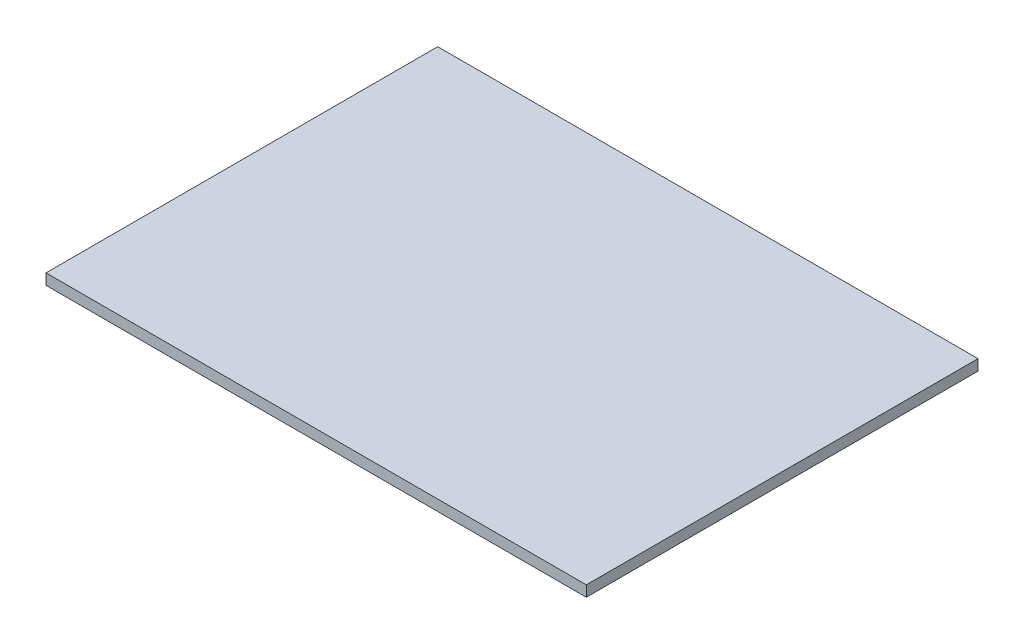
ISO-10303-21;
HEADER;
FILE_DESCRIPTION(('STEP AP214'),'2;1');
FILE_NAME('part.step','',(''),(''),'','','');
FILE_SCHEMA(('AUTOMOTIVE_DESIGN { 1 0 10303 214 1 1 1 1 }'));
ENDSEC;
DATA;
#1=APPLICATION_CONTEXT('core data for automotive mechanical design processes');
#2=APPLICATION_PROTOCOL_DEFINITION('international standard','automotive_design',2000,#1);
#3=PRODUCT_CONTEXT('',#1,'mechanical');
#4=PRODUCT('Part','Part','',(#3));
#5=PRODUCT_RELATED_PRODUCT_CATEGORY('part','',(#4));
#6=PRODUCT_DEFINITION_FORMATION('','',#4);
#7=PRODUCT_DEFINITION_CONTEXT('part definition',#1,'design');
#8=PRODUCT_DEFINITION('design','',#6,#7);
#9=PRODUCT_DEFINITION_SHAPE('','',#8);
#10=(LENGTH_UNIT() NAMED_UNIT(*) SI_UNIT(.MILLI.,.METRE.));
#11=(NAMED_UNIT(*) PLANE_ANGLE_UNIT() SI_UNIT($,.RADIAN.));
#12=(NAMED_UNIT(*) SI_UNIT($,.STERADIAN.) SOLID_ANGLE_UNIT());
#13=UNCERTAINTY_MEASURE_WITH_UNIT(LENGTH_MEASURE(1.E-05),#10,'distance_accuracy_value','');
#14=(GEOMETRIC_REPRESENTATION_CONTEXT(3) GLOBAL_UNCERTAINTY_ASSIGNED_CONTEXT((#13)) GLOBAL_UNIT_ASSIGNED_CONTEXT((#10,
#11,#12)) REPRESENTATION_CONTEXT('',''));
#15=CARTESIAN_POINT('',(0.,0.,0.));
#16=DIRECTION('',(0.,0.,1.));
#17=DIRECTION('',(1.,0.,0.));
#18=AXIS2_PLACEMENT_3D('',#15,#16,#17);
#19=CARTESIAN_POINT('',(317.5,12.7,230.1875));
#20=DIRECTION('',(-1.,0.,0.));
#21=DIRECTION('',(0.,0.,1.));
#22=AXIS2_PLACEMENT_3D('',#19,#20,#21);
#23=PLANE('',#22);
#24=DIRECTION('',(0.,0.,-1.));
#25=VECTOR('',#24,1.);
#26=CARTESIAN_POINT('',(317.5,0.,230.1875));
#27=LINE('',#26,#25);
#28=CARTESIAN_POINT('',(317.5,0.,230.1875));
#29=VERTEX_POINT('',#28);
#30=CARTESIAN_POINT('',(317.5,0.,-230.1875));
#31=VERTEX_POINT('',#30);
#32=EDGE_CURVE('E96',#29,#31,#27,.T.);
#33=ORIENTED_EDGE('',*,*,#32,.T.);
#34=DIRECTION('',(0.,-1.,0.));
#35=VECTOR('',#34,1.);
#36=CARTESIAN_POINT('',(317.5,12.7,-230.1875));
#37=LINE('',#36,#35);
#38=CARTESIAN_POINT('',(317.5,12.7,-230.1875));
#39=VERTEX_POINT('',#38);
#40=EDGE_CURVE('E11',#39,#31,#37,.T.);
#41=ORIENTED_EDGE('',*,*,#40,.F.);
#42=DIRECTION('',(0.,0.,-1.));
#43=VECTOR('',#42,1.);
#44=CARTESIAN_POINT('',(317.5,12.7,230.1875));
#45=LINE('',#44,#43);
#46=CARTESIAN_POINT('',(317.5,12.7,230.1875));
#47=VERTEX_POINT('',#46);
#48=EDGE_CURVE('E84',#47,#39,#45,.T.);
#49=ORIENTED_EDGE('',*,*,#48,.F.);
#50=DIRECTION('',(0.,-1.,0.));
#51=VECTOR('',#50,1.);
#52=CARTESIAN_POINT('',(317.5,12.7,230.1875));
#53=LINE('',#52,#51);
#54=EDGE_CURVE('E92',#47,#29,#53,.T.);
#55=ORIENTED_EDGE('',*,*,#54,.T.);
#56=EDGE_LOOP('',(#33,#41,#49,#55));
#57=FACE_BOUND('',#56,.T.);
#58=ADVANCED_FACE('F33',(#57),#23,.F.);
#59=CARTESIAN_POINT('',(-317.5,12.7,-230.1875));
#60=DIRECTION('',(0.,0.,1.));
#61=DIRECTION('',(1.,0.,0.));
#62=AXIS2_PLACEMENT_3D('',#59,#60,#61);
#63=PLANE('',#62);
#64=DIRECTION('',(-1.,0.,0.));
#65=VECTOR('',#64,1.);
#66=CARTESIAN_POINT('',(-317.5,0.,-230.1875));
#67=LINE('',#66,#65);
#68=CARTESIAN_POINT('',(-317.5,0.,-230.1875));
#69=VERTEX_POINT('',#68);
#70=EDGE_CURVE('E88',#31,#69,#67,.T.);
#71=ORIENTED_EDGE('',*,*,#70,.T.);
#72=DIRECTION('',(0.,-1.,0.));
#73=VECTOR('',#72,1.);
#74=CARTESIAN_POINT('',(-317.5,12.7,-230.1875));
#75=LINE('',#74,#73);
#76=CARTESIAN_POINT('',(-317.5,12.7,-230.1875));
#77=VERTEX_POINT('',#76);
#78=EDGE_CURVE('E41',#77,#69,#75,.T.);
#79=ORIENTED_EDGE('',*,*,#78,.F.);
#80=DIRECTION('',(-1.,0.,0.));
#81=VECTOR('',#80,1.);
#82=CARTESIAN_POINT('',(-317.5,12.7,-230.1875));
#83=LINE('',#82,#81);
#84=EDGE_CURVE('E79',#39,#77,#83,.T.);
#85=ORIENTED_EDGE('',*,*,#84,.F.);
#86=ORIENTED_EDGE('',*,*,#40,.T.);
#87=EDGE_LOOP('',(#71,#79,#85,#86));
#88=FACE_BOUND('',#87,.T.);
#89=ADVANCED_FACE('F87',(#88),#63,.F.);
#90=CARTESIAN_POINT('',(-317.5,12.7,230.1875));
#91=DIRECTION('',(1.,0.,0.));
#92=DIRECTION('',(0.,0.,-1.));
#93=AXIS2_PLACEMENT_3D('',#90,#91,#92);
#94=PLANE('',#93);
#95=DIRECTION('',(0.,0.,1.));
#96=VECTOR('',#95,1.);
#97=CARTESIAN_POINT('',(-317.5,0.,230.1875));
#98=LINE('',#97,#96);
#99=CARTESIAN_POINT('',(-317.5,0.,230.1875));
#100=VERTEX_POINT('',#99);
#101=EDGE_CURVE('E66',#69,#100,#98,.T.);
#102=ORIENTED_EDGE('',*,*,#101,.T.);
#103=DIRECTION('',(0.,-1.,0.));
#104=VECTOR('',#103,1.);
#105=CARTESIAN_POINT('',(-317.5,12.7,230.1875));
#106=LINE('',#105,#104);
#107=CARTESIAN_POINT('',(-317.5,12.7,230.1875));
#108=VERTEX_POINT('',#107);
#109=EDGE_CURVE('E89',#108,#100,#106,.T.);
#110=ORIENTED_EDGE('',*,*,#109,.F.);
#111=DIRECTION('',(0.,0.,1.));
#112=VECTOR('',#111,1.);
#113=CARTESIAN_POINT('',(-317.5,12.7,230.1875));
#114=LINE('',#113,#112);
#115=EDGE_CURVE('E82',#77,#108,#114,.T.);
#116=ORIENTED_EDGE('',*,*,#115,.F.);
#117=ORIENTED_EDGE('',*,*,#78,.T.);
#118=EDGE_LOOP('',(#102,#110,#116,#117));
#119=FACE_BOUND('',#118,.T.);
#120=ADVANCED_FACE('F90',(#119),#94,.F.);
#121=CARTESIAN_POINT('',(-317.5,12.7,230.1875));
#122=DIRECTION('',(0.,0.,-1.));
#123=DIRECTION('',(-1.,0.,0.));
#124=AXIS2_PLACEMENT_3D('',#121,#122,#123);
#125=PLANE('',#124);
#126=DIRECTION('',(1.,0.,0.));
#127=VECTOR('',#126,1.);
#128=CARTESIAN_POINT('',(-317.5,0.,230.1875));
#129=LINE('',#128,#127);
#130=EDGE_CURVE('E72',#100,#29,#129,.T.);
#131=ORIENTED_EDGE('',*,*,#130,.T.);
#132=ORIENTED_EDGE('',*,*,#54,.F.);
#133=DIRECTION('',(1.,0.,0.));
#134=VECTOR('',#133,1.);
#135=CARTESIAN_POINT('',(-317.5,12.7,230.1875));
#136=LINE('',#135,#134);
#137=EDGE_CURVE('E49',#108,#47,#136,.T.);
#138=ORIENTED_EDGE('',*,*,#137,.F.);
#139=ORIENTED_EDGE('',*,*,#109,.T.);
#140=EDGE_LOOP('',(#131,#132,#138,#139));
#141=FACE_BOUND('',#140,.T.);
#142=ADVANCED_FACE('F103',(#141),#125,.F.);
#143=CARTESIAN_POINT('',(0.,12.7,0.));
#144=DIRECTION('',(0.,-1.,0.));
#145=DIRECTION('',(0.,0.,-1.));
#146=AXIS2_PLACEMENT_3D('',#143,#144,#145);
#147=PLANE('',#146);
#148=ORIENTED_EDGE('',*,*,#48,.T.);
#149=ORIENTED_EDGE('',*,*,#84,.T.);
#150=ORIENTED_EDGE('',*,*,#115,.T.);
#151=ORIENTED_EDGE('',*,*,#137,.T.);
#152=EDGE_LOOP('',(#148,#149,#150,#151));
#153=FACE_BOUND('',#152,.T.);
#154=ADVANCED_FACE('F80',(#153),#147,.F.);
#155=CARTESIAN_POINT('',(0.,0.,0.));
#156=DIRECTION('',(0.,-1.,0.));
#157=DIRECTION('',(0.,0.,-1.));
#158=AXIS2_PLACEMENT_3D('',#155,#156,#157);
#159=PLANE('',#158);
#160=ORIENTED_EDGE('',*,*,#32,.F.);
#161=ORIENTED_EDGE('',*,*,#130,.F.);
#162=ORIENTED_EDGE('',*,*,#101,.F.);
#163=ORIENTED_EDGE('',*,*,#70,.F.);
#164=EDGE_LOOP('',(#160,#161,#162,#163));
#165=FACE_BOUND('',#164,.T.);
#166=ADVANCED_FACE('F106',(#165),#159,.T.);
#167=CLOSED_SHELL('',(#58,#89,#120,#142,#154,#166));
#168=MANIFOLD_SOLID_BREP('B2',#167);
#169=ADVANCED_BREP_SHAPE_REPRESENTATION('',(#18,#168),#14);
#170=SHAPE_DEFINITION_REPRESENTATION(#9,#169);
ENDSEC;
END-ISO-10303-21;
